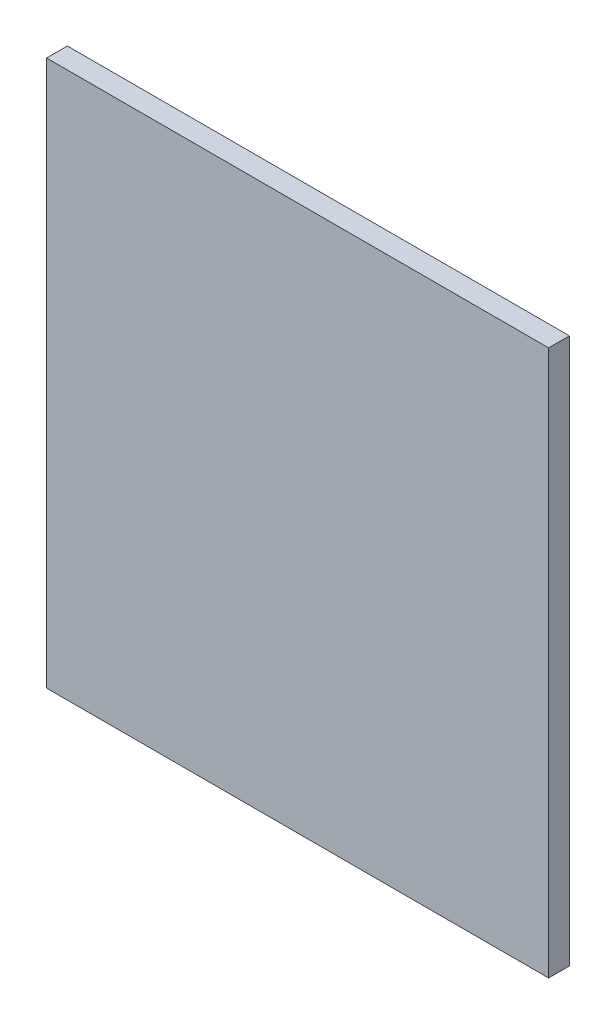
ISO-10303-21;
HEADER;
FILE_DESCRIPTION(('STEP AP214'),'2;1');
FILE_NAME('part.step','',(''),(''),'','','');
FILE_SCHEMA(('AUTOMOTIVE_DESIGN { 1 0 10303 214 1 1 1 1 }'));
ENDSEC;
DATA;
#1=APPLICATION_CONTEXT('core data for automotive mechanical design processes');
#2=APPLICATION_PROTOCOL_DEFINITION('international standard','automotive_design',2000,#1);
#3=PRODUCT_CONTEXT('',#1,'mechanical');
#4=PRODUCT('Part','Part','',(#3));
#5=PRODUCT_RELATED_PRODUCT_CATEGORY('part','',(#4));
#6=PRODUCT_DEFINITION_FORMATION('','',#4);
#7=PRODUCT_DEFINITION_CONTEXT('part definition',#1,'design');
#8=PRODUCT_DEFINITION('design','',#6,#7);
#9=PRODUCT_DEFINITION_SHAPE('','',#8);
#10=(LENGTH_UNIT() NAMED_UNIT(*) SI_UNIT(.MILLI.,.METRE.));
#11=(NAMED_UNIT(*) PLANE_ANGLE_UNIT() SI_UNIT($,.RADIAN.));
#12=(NAMED_UNIT(*) SI_UNIT($,.STERADIAN.) SOLID_ANGLE_UNIT());
#13=UNCERTAINTY_MEASURE_WITH_UNIT(LENGTH_MEASURE(1.E-05),#10,'distance_accuracy_value','');
#14=(GEOMETRIC_REPRESENTATION_CONTEXT(3) GLOBAL_UNCERTAINTY_ASSIGNED_CONTEXT((#13)) GLOBAL_UNIT_ASSIGNED_CONTEXT((#10,
#11,#12)) REPRESENTATION_CONTEXT('',''));
#15=CARTESIAN_POINT('',(0.,0.,0.));
#16=DIRECTION('',(0.,0.,1.));
#17=DIRECTION('',(1.,0.,0.));
#18=AXIS2_PLACEMENT_3D('',#15,#16,#17);
#19=CARTESIAN_POINT('',(0.,0.,1117.6));
#20=DIRECTION('',(0.,0.,-1.));
#21=DIRECTION('',(-1.,0.,0.));
#22=AXIS2_PLACEMENT_3D('',#19,#20,#21);
#23=PLANE('',#22);
#24=DIRECTION('',(0.,-1.,0.));
#25=VECTOR('',#24,1.);
#26=CARTESIAN_POINT('',(-306.531097362103,-525.863960413632,1117.6));
#27=LINE('',#26,#25);
#28=CARTESIAN_POINT('',(-306.531097362103,140.529031303583,1117.6));
#29=VERTEX_POINT('',#28);
#30=CARTESIAN_POINT('',(-306.531097362103,-525.863960413632,1117.6));
#31=VERTEX_POINT('',#30);
#32=EDGE_CURVE('E88',#29,#31,#27,.T.);
#33=ORIENTED_EDGE('',*,*,#32,.F.);
#34=DIRECTION('',(-1.,0.,0.));
#35=VECTOR('',#34,1.);
#36=CARTESIAN_POINT('',(-306.531097362103,140.529031303583,1117.6));
#37=LINE('',#36,#35);
#38=CARTESIAN_POINT('',(306.531097362103,140.529031303583,1117.6));
#39=VERTEX_POINT('',#38);
#40=EDGE_CURVE('E78',#39,#29,#37,.T.);
#41=ORIENTED_EDGE('',*,*,#40,.F.);
#42=DIRECTION('',(0.,1.,0.));
#43=VECTOR('',#42,1.);
#44=CARTESIAN_POINT('',(306.531097362103,-525.863960413632,1117.6));
#45=LINE('',#44,#43);
#46=CARTESIAN_POINT('',(306.531097362103,-525.863960413632,1117.6));
#47=VERTEX_POINT('',#46);
#48=EDGE_CURVE('E87',#47,#39,#45,.T.);
#49=ORIENTED_EDGE('',*,*,#48,.F.);
#50=DIRECTION('',(1.,0.,0.));
#51=VECTOR('',#50,1.);
#52=CARTESIAN_POINT('',(-306.531097362103,-525.863960413632,1117.6));
#53=LINE('',#52,#51);
#54=EDGE_CURVE('E90',#31,#47,#53,.T.);
#55=ORIENTED_EDGE('',*,*,#54,.F.);
#56=EDGE_LOOP('',(#33,#41,#49,#55));
#57=FACE_BOUND('',#56,.T.);
#58=ADVANCED_FACE('F33',(#57),#23,.T.);
#59=CARTESIAN_POINT('',(-306.531097362103,140.529031303583,-228.6));
#60=DIRECTION('',(0.,1.,0.));
#61=DIRECTION('',(0.,0.,1.));
#62=AXIS2_PLACEMENT_3D('',#59,#60,#61);
#63=PLANE('',#62);
#64=DIRECTION('',(0.,0.,1.));
#65=VECTOR('',#64,1.);
#66=CARTESIAN_POINT('',(306.531097362103,140.529031303583,-228.6));
#67=LINE('',#66,#65);
#68=CARTESIAN_POINT('',(306.531097362103,140.529031303583,1143.));
#69=VERTEX_POINT('',#68);
#70=EDGE_CURVE('E84',#39,#69,#67,.T.);
#71=ORIENTED_EDGE('',*,*,#70,.F.);
#72=ORIENTED_EDGE('',*,*,#40,.T.);
#73=DIRECTION('',(0.,0.,1.));
#74=VECTOR('',#73,1.);
#75=CARTESIAN_POINT('',(-306.531097362103,140.529031303583,-228.6));
#76=LINE('',#75,#74);
#77=CARTESIAN_POINT('',(-306.531097362103,140.529031303583,1143.));
#78=VERTEX_POINT('',#77);
#79=EDGE_CURVE('E37',#29,#78,#76,.T.);
#80=ORIENTED_EDGE('',*,*,#79,.T.);
#81=DIRECTION('',(-1.,0.,0.));
#82=VECTOR('',#81,1.);
#83=CARTESIAN_POINT('',(-306.531097362103,140.529031303583,1143.));
#84=LINE('',#83,#82);
#85=EDGE_CURVE('E97',#69,#78,#84,.T.);
#86=ORIENTED_EDGE('',*,*,#85,.F.);
#87=EDGE_LOOP('',(#71,#72,#80,#86));
#88=FACE_BOUND('',#87,.T.);
#89=ADVANCED_FACE('F80',(#88),#63,.T.);
#90=CARTESIAN_POINT('',(0.,0.,1143.));
#91=DIRECTION('',(0.,0.,-1.));
#92=DIRECTION('',(-1.,0.,0.));
#93=AXIS2_PLACEMENT_3D('',#90,#91,#92);
#94=PLANE('',#93);
#95=DIRECTION('',(0.,-1.,0.));
#96=VECTOR('',#95,1.);
#97=CARTESIAN_POINT('',(-306.531097362103,-525.863960413632,1143.));
#98=LINE('',#97,#96);
#99=CARTESIAN_POINT('',(-306.531097362103,-525.863960413632,1143.));
#100=VERTEX_POINT('',#99);
#101=EDGE_CURVE('E11',#78,#100,#98,.T.);
#102=ORIENTED_EDGE('',*,*,#101,.T.);
#103=DIRECTION('',(1.,0.,0.));
#104=VECTOR('',#103,1.);
#105=CARTESIAN_POINT('',(-306.531097362103,-525.863960413632,1143.));
#106=LINE('',#105,#104);
#107=CARTESIAN_POINT('',(306.531097362103,-525.863960413632,1143.));
#108=VERTEX_POINT('',#107);
#109=EDGE_CURVE('E42',#100,#108,#106,.T.);
#110=ORIENTED_EDGE('',*,*,#109,.T.);
#111=DIRECTION('',(0.,1.,0.));
#112=VECTOR('',#111,1.);
#113=CARTESIAN_POINT('',(306.531097362103,-525.863960413632,1143.));
#114=LINE('',#113,#112);
#115=EDGE_CURVE('E98',#108,#69,#114,.T.);
#116=ORIENTED_EDGE('',*,*,#115,.T.);
#117=ORIENTED_EDGE('',*,*,#85,.T.);
#118=EDGE_LOOP('',(#102,#110,#116,#117));
#119=FACE_BOUND('',#118,.T.);
#120=ADVANCED_FACE('F105',(#119),#94,.F.);
#121=CARTESIAN_POINT('',(306.531097362103,-525.863960413632,-228.6));
#122=DIRECTION('',(1.,0.,0.));
#123=DIRECTION('',(0.,0.,-1.));
#124=AXIS2_PLACEMENT_3D('',#121,#122,#123);
#125=PLANE('',#124);
#126=DIRECTION('',(0.,0.,1.));
#127=VECTOR('',#126,1.);
#128=CARTESIAN_POINT('',(306.531097362103,-525.863960413632,-228.6));
#129=LINE('',#128,#127);
#130=EDGE_CURVE('E57',#47,#108,#129,.T.);
#131=ORIENTED_EDGE('',*,*,#130,.F.);
#132=ORIENTED_EDGE('',*,*,#48,.T.);
#133=ORIENTED_EDGE('',*,*,#70,.T.);
#134=ORIENTED_EDGE('',*,*,#115,.F.);
#135=EDGE_LOOP('',(#131,#132,#133,#134));
#136=FACE_BOUND('',#135,.T.);
#137=ADVANCED_FACE('F107',(#136),#125,.T.);
#138=CARTESIAN_POINT('',(-306.531097362103,-525.863960413632,-228.6));
#139=DIRECTION('',(-1.,0.,0.));
#140=DIRECTION('',(0.,0.,1.));
#141=AXIS2_PLACEMENT_3D('',#138,#139,#140);
#142=PLANE('',#141);
#143=ORIENTED_EDGE('',*,*,#79,.F.);
#144=ORIENTED_EDGE('',*,*,#32,.T.);
#145=DIRECTION('',(0.,0.,1.));
#146=VECTOR('',#145,1.);
#147=CARTESIAN_POINT('',(-306.531097362103,-525.863960413632,-228.6));
#148=LINE('',#147,#146);
#149=EDGE_CURVE('E50',#31,#100,#148,.T.);
#150=ORIENTED_EDGE('',*,*,#149,.T.);
#151=ORIENTED_EDGE('',*,*,#101,.F.);
#152=EDGE_LOOP('',(#143,#144,#150,#151));
#153=FACE_BOUND('',#152,.T.);
#154=ADVANCED_FACE('F92',(#153),#142,.T.);
#155=CARTESIAN_POINT('',(-306.531097362103,-525.863960413632,-228.6));
#156=DIRECTION('',(0.,-1.,0.));
#157=DIRECTION('',(0.,0.,-1.));
#158=AXIS2_PLACEMENT_3D('',#155,#156,#157);
#159=PLANE('',#158);
#160=ORIENTED_EDGE('',*,*,#149,.F.);
#161=ORIENTED_EDGE('',*,*,#54,.T.);
#162=ORIENTED_EDGE('',*,*,#130,.T.);
#163=ORIENTED_EDGE('',*,*,#109,.F.);
#164=EDGE_LOOP('',(#160,#161,#162,#163));
#165=FACE_BOUND('',#164,.T.);
#166=ADVANCED_FACE('F35',(#165),#159,.T.);
#167=CLOSED_SHELL('',(#58,#89,#120,#137,#154,#166));
#168=MANIFOLD_SOLID_BREP('B2',#167);
#169=ADVANCED_BREP_SHAPE_REPRESENTATION('',(#18,#168),#14);
#170=SHAPE_DEFINITION_REPRESENTATION(#9,#169);
ENDSEC;
END-ISO-10303-21;
